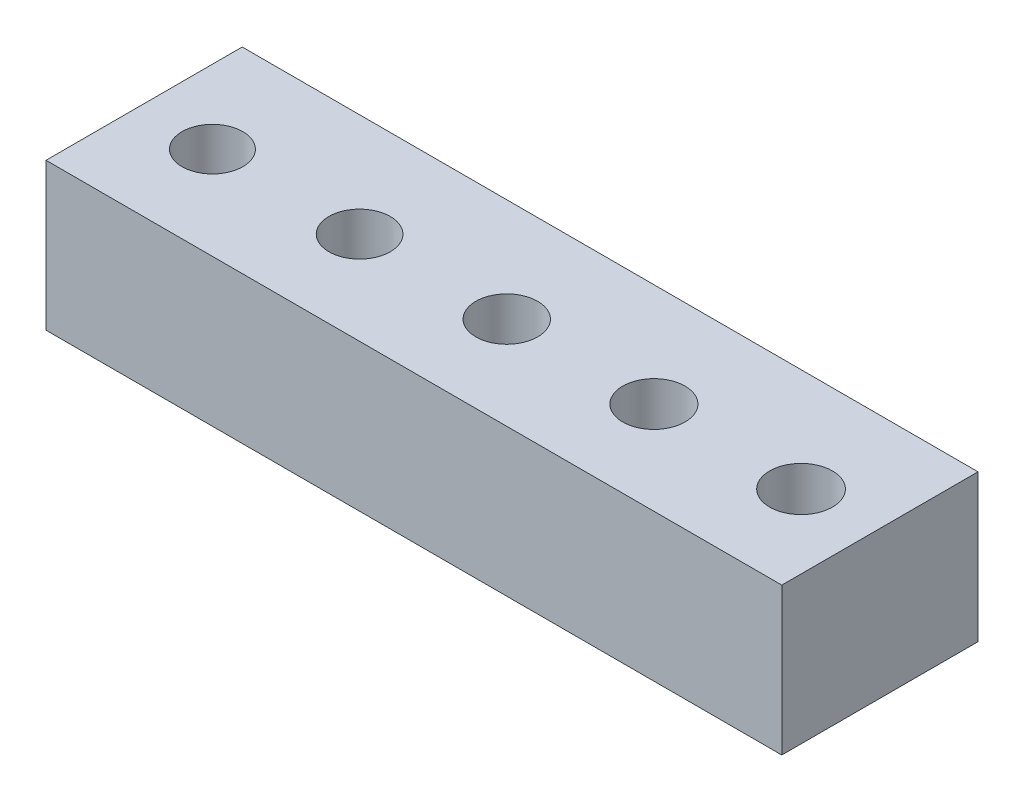
ISO-10303-21;
HEADER;
FILE_DESCRIPTION(('STEP AP214'),'2;1');
FILE_NAME('part.step','',(''),(''),'','','');
FILE_SCHEMA(('AUTOMOTIVE_DESIGN { 1 0 10303 214 1 1 1 1 }'));
ENDSEC;
DATA;
#1=APPLICATION_CONTEXT('core data for automotive mechanical design processes');
#2=APPLICATION_PROTOCOL_DEFINITION('international standard','automotive_design',2000,#1);
#3=PRODUCT_CONTEXT('',#1,'mechanical');
#4=PRODUCT('Part','Part','',(#3));
#5=PRODUCT_RELATED_PRODUCT_CATEGORY('part','',(#4));
#6=PRODUCT_DEFINITION_FORMATION('','',#4);
#7=PRODUCT_DEFINITION_CONTEXT('part definition',#1,'design');
#8=PRODUCT_DEFINITION('design','',#6,#7);
#9=PRODUCT_DEFINITION_SHAPE('','',#8);
#10=(LENGTH_UNIT() NAMED_UNIT(*) SI_UNIT(.MILLI.,.METRE.));
#11=(NAMED_UNIT(*) PLANE_ANGLE_UNIT() SI_UNIT($,.RADIAN.));
#12=(NAMED_UNIT(*) SI_UNIT($,.STERADIAN.) SOLID_ANGLE_UNIT());
#13=UNCERTAINTY_MEASURE_WITH_UNIT(LENGTH_MEASURE(1.E-05),#10,'distance_accuracy_value','');
#14=(GEOMETRIC_REPRESENTATION_CONTEXT(3) GLOBAL_UNCERTAINTY_ASSIGNED_CONTEXT((#13)) GLOBAL_UNIT_ASSIGNED_CONTEXT((#10,
#11,#12)) REPRESENTATION_CONTEXT('',''));
#15=CARTESIAN_POINT('',(0.,0.,0.));
#16=DIRECTION('',(0.,0.,1.));
#17=DIRECTION('',(1.,0.,0.));
#18=AXIS2_PLACEMENT_3D('',#15,#16,#17);
#19=CARTESIAN_POINT('',(0.,7.62,0.));
#20=DIRECTION('',(1.,0.,0.));
#21=DIRECTION('',(0.,0.,-1.));
#22=AXIS2_PLACEMENT_3D('',#19,#20,#21);
#23=PLANE('',#22);
#24=DIRECTION('',(0.,0.,1.));
#25=VECTOR('',#24,1.);
#26=CARTESIAN_POINT('',(0.,0.,0.));
#27=LINE('',#26,#25);
#28=CARTESIAN_POINT('',(0.,0.,-10.16));
#29=VERTEX_POINT('',#28);
#30=CARTESIAN_POINT('',(0.,0.,0.));
#31=VERTEX_POINT('',#30);
#32=EDGE_CURVE('E111',#29,#31,#27,.T.);
#33=ORIENTED_EDGE('',*,*,#32,.T.);
#34=DIRECTION('',(0.,-1.,0.));
#35=VECTOR('',#34,1.);
#36=CARTESIAN_POINT('',(0.,7.62,0.));
#37=LINE('',#36,#35);
#38=CARTESIAN_POINT('',(0.,7.62,0.));
#39=VERTEX_POINT('',#38);
#40=EDGE_CURVE('E11',#39,#31,#37,.T.);
#41=ORIENTED_EDGE('',*,*,#40,.F.);
#42=DIRECTION('',(0.,0.,1.));
#43=VECTOR('',#42,1.);
#44=CARTESIAN_POINT('',(0.,7.62,0.));
#45=LINE('',#44,#43);
#46=CARTESIAN_POINT('',(0.,7.62,-10.16));
#47=VERTEX_POINT('',#46);
#48=EDGE_CURVE('E95',#47,#39,#45,.T.);
#49=ORIENTED_EDGE('',*,*,#48,.F.);
#50=DIRECTION('',(0.,-1.,0.));
#51=VECTOR('',#50,1.);
#52=CARTESIAN_POINT('',(0.,7.62,-10.16));
#53=LINE('',#52,#51);
#54=EDGE_CURVE('E107',#47,#29,#53,.T.);
#55=ORIENTED_EDGE('',*,*,#54,.T.);
#56=EDGE_LOOP('',(#33,#41,#49,#55));
#57=FACE_BOUND('',#56,.T.);
#58=ADVANCED_FACE('F43',(#57),#23,.F.);
#59=CARTESIAN_POINT('',(0.,7.62,0.));
#60=DIRECTION('',(0.,0.,-1.));
#61=DIRECTION('',(-1.,0.,0.));
#62=AXIS2_PLACEMENT_3D('',#59,#60,#61);
#63=PLANE('',#62);
#64=DIRECTION('',(1.,0.,0.));
#65=VECTOR('',#64,1.);
#66=CARTESIAN_POINT('',(0.,0.,0.));
#67=LINE('',#66,#65);
#68=CARTESIAN_POINT('',(38.1,0.,0.));
#69=VERTEX_POINT('',#68);
#70=EDGE_CURVE('E100',#31,#69,#67,.T.);
#71=ORIENTED_EDGE('',*,*,#70,.T.);
#72=DIRECTION('',(0.,-1.,0.));
#73=VECTOR('',#72,1.);
#74=CARTESIAN_POINT('',(38.1,7.62,0.));
#75=LINE('',#74,#73);
#76=CARTESIAN_POINT('',(38.1,7.62,0.));
#77=VERTEX_POINT('',#76);
#78=EDGE_CURVE('E52',#77,#69,#75,.T.);
#79=ORIENTED_EDGE('',*,*,#78,.F.);
#80=DIRECTION('',(1.,0.,0.));
#81=VECTOR('',#80,1.);
#82=CARTESIAN_POINT('',(0.,7.62,0.));
#83=LINE('',#82,#81);
#84=EDGE_CURVE('E90',#39,#77,#83,.T.);
#85=ORIENTED_EDGE('',*,*,#84,.F.);
#86=ORIENTED_EDGE('',*,*,#40,.T.);
#87=EDGE_LOOP('',(#71,#79,#85,#86));
#88=FACE_BOUND('',#87,.T.);
#89=ADVANCED_FACE('F99',(#88),#63,.F.);
#90=CARTESIAN_POINT('',(38.1,7.62,0.));
#91=DIRECTION('',(-1.,0.,0.));
#92=DIRECTION('',(0.,0.,1.));
#93=AXIS2_PLACEMENT_3D('',#90,#91,#92);
#94=PLANE('',#93);
#95=DIRECTION('',(0.,0.,-1.));
#96=VECTOR('',#95,1.);
#97=CARTESIAN_POINT('',(38.1,0.,0.));
#98=LINE('',#97,#96);
#99=CARTESIAN_POINT('',(38.1,0.,-10.16));
#100=VERTEX_POINT('',#99);
#101=EDGE_CURVE('E77',#69,#100,#98,.T.);
#102=ORIENTED_EDGE('',*,*,#101,.T.);
#103=DIRECTION('',(0.,-1.,0.));
#104=VECTOR('',#103,1.);
#105=CARTESIAN_POINT('',(38.1,7.62,-10.16));
#106=LINE('',#105,#104);
#107=CARTESIAN_POINT('',(38.1,7.62,-10.16));
#108=VERTEX_POINT('',#107);
#109=EDGE_CURVE('E102',#108,#100,#106,.T.);
#110=ORIENTED_EDGE('',*,*,#109,.F.);
#111=DIRECTION('',(0.,0.,-1.));
#112=VECTOR('',#111,1.);
#113=CARTESIAN_POINT('',(38.1,7.62,0.));
#114=LINE('',#113,#112);
#115=EDGE_CURVE('E93',#77,#108,#114,.T.);
#116=ORIENTED_EDGE('',*,*,#115,.F.);
#117=ORIENTED_EDGE('',*,*,#78,.T.);
#118=EDGE_LOOP('',(#102,#110,#116,#117));
#119=FACE_BOUND('',#118,.T.);
#120=ADVANCED_FACE('F103',(#119),#94,.F.);
#121=CARTESIAN_POINT('',(0.,7.62,-10.16));
#122=DIRECTION('',(0.,0.,1.));
#123=DIRECTION('',(1.,0.,0.));
#124=AXIS2_PLACEMENT_3D('',#121,#122,#123);
#125=PLANE('',#124);
#126=DIRECTION('',(-1.,0.,0.));
#127=VECTOR('',#126,1.);
#128=CARTESIAN_POINT('',(0.,0.,-10.16));
#129=LINE('',#128,#127);
#130=EDGE_CURVE('E83',#100,#29,#129,.T.);
#131=ORIENTED_EDGE('',*,*,#130,.T.);
#132=ORIENTED_EDGE('',*,*,#54,.F.);
#133=DIRECTION('',(-1.,0.,0.));
#134=VECTOR('',#133,1.);
#135=CARTESIAN_POINT('',(0.,7.62,-10.16));
#136=LINE('',#135,#134);
#137=EDGE_CURVE('E60',#108,#47,#136,.T.);
#138=ORIENTED_EDGE('',*,*,#137,.F.);
#139=ORIENTED_EDGE('',*,*,#109,.T.);
#140=EDGE_LOOP('',(#131,#132,#138,#139));
#141=FACE_BOUND('',#140,.T.);
#142=ADVANCED_FACE('F125',(#141),#125,.F.);
#143=CARTESIAN_POINT('',(0.,7.62,0.));
#144=DIRECTION('',(0.,-1.,0.));
#145=DIRECTION('',(0.,0.,-1.));
#146=AXIS2_PLACEMENT_3D('',#143,#144,#145);
#147=PLANE('',#146);
#148=CARTESIAN_POINT('',(3.81,7.62,-4.80734647120761));
#149=DIRECTION('',(0.,-1.,0.));
#150=DIRECTION('',(0.,0.,-1.));
#151=AXIS2_PLACEMENT_3D('',#148,#149,#150);
#152=CIRCLE('',#151,1.5748);
#153=CARTESIAN_POINT('',(3.81,7.62,-6.38214647120761));
#154=VERTEX_POINT('',#153);
#155=EDGE_CURVE('E149',#154,#154,#152,.T.);
#156=ORIENTED_EDGE('',*,*,#155,.T.);
#157=EDGE_LOOP('',(#156));
#158=FACE_BOUND('',#157,.T.);
#159=CARTESIAN_POINT('',(19.05,7.62,-4.80734647120761));
#160=DIRECTION('',(0.,-1.,0.));
#161=DIRECTION('',(0.,0.,-1.));
#162=AXIS2_PLACEMENT_3D('',#159,#160,#161);
#163=CIRCLE('',#162,1.6002);
#164=CARTESIAN_POINT('',(19.05,7.62,-6.40754647120761));
#165=VERTEX_POINT('',#164);
#166=EDGE_CURVE('E154',#165,#165,#163,.T.);
#167=ORIENTED_EDGE('',*,*,#166,.T.);
#168=EDGE_LOOP('',(#167));
#169=FACE_BOUND('',#168,.T.);
#170=CARTESIAN_POINT('',(26.67,7.62,-4.80734647120761));
#171=DIRECTION('',(0.,-1.,0.));
#172=DIRECTION('',(0.,0.,-1.));
#173=AXIS2_PLACEMENT_3D('',#170,#171,#172);
#174=CIRCLE('',#173,1.6129);
#175=CARTESIAN_POINT('',(26.67,7.62,-6.42024647120761));
#176=VERTEX_POINT('',#175);
#177=EDGE_CURVE('E137',#176,#176,#174,.T.);
#178=ORIENTED_EDGE('',*,*,#177,.T.);
#179=EDGE_LOOP('',(#178));
#180=FACE_BOUND('',#179,.T.);
#181=CARTESIAN_POINT('',(34.29,7.62,-4.80734647120761));
#182=DIRECTION('',(0.,-1.,0.));
#183=DIRECTION('',(0.,0.,-1.));
#184=AXIS2_PLACEMENT_3D('',#181,#182,#183);
#185=CIRCLE('',#184,1.6256);
#186=CARTESIAN_POINT('',(34.29,7.62,-6.43294647120761));
#187=VERTEX_POINT('',#186);
#188=EDGE_CURVE('E136',#187,#187,#185,.T.);
#189=ORIENTED_EDGE('',*,*,#188,.T.);
#190=EDGE_LOOP('',(#189));
#191=FACE_BOUND('',#190,.T.);
#192=CARTESIAN_POINT('',(11.43,7.62,-4.80734647120761));
#193=DIRECTION('',(0.,-1.,0.));
#194=DIRECTION('',(0.,0.,-1.));
#195=AXIS2_PLACEMENT_3D('',#192,#193,#194);
#196=CIRCLE('',#195,1.5875);
#197=CARTESIAN_POINT('',(11.43,7.62,-6.39484647120761));
#198=VERTEX_POINT('',#197);
#199=EDGE_CURVE('E145',#198,#198,#196,.T.);
#200=ORIENTED_EDGE('',*,*,#199,.T.);
#201=EDGE_LOOP('',(#200));
#202=FACE_BOUND('',#201,.T.);
#203=ORIENTED_EDGE('',*,*,#48,.T.);
#204=ORIENTED_EDGE('',*,*,#84,.T.);
#205=ORIENTED_EDGE('',*,*,#115,.T.);
#206=ORIENTED_EDGE('',*,*,#137,.T.);
#207=EDGE_LOOP('',(#203,#204,#205,#206));
#208=FACE_BOUND('',#207,.T.);
#209=ADVANCED_FACE('F91',(#158,#169,#180,#191,#202,#208),#147,.F.);
#210=CARTESIAN_POINT('',(0.,0.,0.));
#211=DIRECTION('',(0.,-1.,0.));
#212=DIRECTION('',(0.,0.,-1.));
#213=AXIS2_PLACEMENT_3D('',#210,#211,#212);
#214=PLANE('',#213);
#215=ORIENTED_EDGE('',*,*,#32,.F.);
#216=ORIENTED_EDGE('',*,*,#130,.F.);
#217=ORIENTED_EDGE('',*,*,#101,.F.);
#218=ORIENTED_EDGE('',*,*,#70,.F.);
#219=EDGE_LOOP('',(#215,#216,#217,#218));
#220=FACE_BOUND('',#219,.T.);
#221=ADVANCED_FACE('F128',(#220),#214,.T.);
#222=CARTESIAN_POINT('',(11.43,2.8702,-4.80734647120761));
#223=DIRECTION('',(0.,1.,0.));
#224=DIRECTION('',(0.,0.,1.));
#225=AXIS2_PLACEMENT_3D('',#222,#223,#224);
#226=CYLINDRICAL_SURFACE('',#225,1.5875);
#227=CARTESIAN_POINT('',(11.43,2.8702,-4.80734647120761));
#228=DIRECTION('',(0.,-1.,0.));
#229=DIRECTION('',(0.,0.,-1.));
#230=AXIS2_PLACEMENT_3D('',#227,#228,#229);
#231=CIRCLE('',#230,1.5875);
#232=CARTESIAN_POINT('',(11.43,2.8702,-6.39484647120761));
#233=VERTEX_POINT('',#232);
#234=EDGE_CURVE('E141',#233,#233,#231,.T.);
#235=ORIENTED_EDGE('',*,*,#234,.T.);
#236=EDGE_LOOP('',(#235));
#237=FACE_BOUND('',#236,.T.);
#238=ORIENTED_EDGE('',*,*,#199,.F.);
#239=EDGE_LOOP('',(#238));
#240=FACE_BOUND('',#239,.T.);
#241=ADVANCED_FACE('F196',(#237,#240),#226,.F.);
#242=CARTESIAN_POINT('',(11.43,2.8702,-4.80734647120761));
#243=DIRECTION('',(0.,-1.,0.));
#244=DIRECTION('',(0.,0.,-1.));
#245=AXIS2_PLACEMENT_3D('',#242,#243,#244);
#246=PLANE('',#245);
#247=ORIENTED_EDGE('',*,*,#234,.F.);
#248=EDGE_LOOP('',(#247));
#249=FACE_BOUND('',#248,.T.);
#250=ADVANCED_FACE('F208',(#249),#246,.F.);
#251=CARTESIAN_POINT('',(34.29,2.8702,-4.80734647120761));
#252=DIRECTION('',(0.,1.,0.));
#253=DIRECTION('',(0.,0.,1.));
#254=AXIS2_PLACEMENT_3D('',#251,#252,#253);
#255=CYLINDRICAL_SURFACE('',#254,1.6256);
#256=CARTESIAN_POINT('',(34.29,2.8702,-4.80734647120761));
#257=DIRECTION('',(0.,-1.,0.));
#258=DIRECTION('',(0.,0.,-1.));
#259=AXIS2_PLACEMENT_3D('',#256,#257,#258);
#260=CIRCLE('',#259,1.6256);
#261=CARTESIAN_POINT('',(34.29,2.8702,-6.43294647120761));
#262=VERTEX_POINT('',#261);
#263=EDGE_CURVE('E132',#262,#262,#260,.T.);
#264=ORIENTED_EDGE('',*,*,#263,.T.);
#265=EDGE_LOOP('',(#264));
#266=FACE_BOUND('',#265,.T.);
#267=ORIENTED_EDGE('',*,*,#188,.F.);
#268=EDGE_LOOP('',(#267));
#269=FACE_BOUND('',#268,.T.);
#270=ADVANCED_FACE('F204',(#266,#269),#255,.F.);
#271=CARTESIAN_POINT('',(34.29,2.8702,-4.80734647120761));
#272=DIRECTION('',(0.,-1.,0.));
#273=DIRECTION('',(0.,0.,-1.));
#274=AXIS2_PLACEMENT_3D('',#271,#272,#273);
#275=PLANE('',#274);
#276=ORIENTED_EDGE('',*,*,#263,.F.);
#277=EDGE_LOOP('',(#276));
#278=FACE_BOUND('',#277,.T.);
#279=ADVANCED_FACE('F200',(#278),#275,.F.);
#280=CARTESIAN_POINT('',(26.67,2.8702,-4.80734647120761));
#281=DIRECTION('',(0.,1.,0.));
#282=DIRECTION('',(0.,0.,1.));
#283=AXIS2_PLACEMENT_3D('',#280,#281,#282);
#284=CYLINDRICAL_SURFACE('',#283,1.6129);
#285=CARTESIAN_POINT('',(26.67,2.8702,-4.80734647120761));
#286=DIRECTION('',(0.,-1.,0.));
#287=DIRECTION('',(0.,0.,-1.));
#288=AXIS2_PLACEMENT_3D('',#285,#286,#287);
#289=CIRCLE('',#288,1.6129);
#290=CARTESIAN_POINT('',(26.67,2.8702,-6.42024647120761));
#291=VERTEX_POINT('',#290);
#292=EDGE_CURVE('E158',#291,#291,#289,.T.);
#293=ORIENTED_EDGE('',*,*,#292,.T.);
#294=EDGE_LOOP('',(#293));
#295=FACE_BOUND('',#294,.T.);
#296=ORIENTED_EDGE('',*,*,#177,.F.);
#297=EDGE_LOOP('',(#296));
#298=FACE_BOUND('',#297,.T.);
#299=ADVANCED_FACE('F203',(#295,#298),#284,.F.);
#300=CARTESIAN_POINT('',(26.67,2.8702,-4.80734647120761));
#301=DIRECTION('',(0.,-1.,0.));
#302=DIRECTION('',(0.,0.,-1.));
#303=AXIS2_PLACEMENT_3D('',#300,#301,#302);
#304=PLANE('',#303);
#305=ORIENTED_EDGE('',*,*,#292,.F.);
#306=EDGE_LOOP('',(#305));
#307=FACE_BOUND('',#306,.T.);
#308=ADVANCED_FACE('F222',(#307),#304,.F.);
#309=CARTESIAN_POINT('',(19.05,2.8702,-4.80734647120761));
#310=DIRECTION('',(0.,1.,0.));
#311=DIRECTION('',(0.,0.,1.));
#312=AXIS2_PLACEMENT_3D('',#309,#310,#311);
#313=CYLINDRICAL_SURFACE('',#312,1.6002);
#314=CARTESIAN_POINT('',(19.05,2.8702,-4.80734647120761));
#315=DIRECTION('',(0.,-1.,0.));
#316=DIRECTION('',(0.,0.,-1.));
#317=AXIS2_PLACEMENT_3D('',#314,#315,#316);
#318=CIRCLE('',#317,1.6002);
#319=CARTESIAN_POINT('',(19.05,2.8702,-6.40754647120761));
#320=VERTEX_POINT('',#319);
#321=EDGE_CURVE('E150',#320,#320,#318,.T.);
#322=ORIENTED_EDGE('',*,*,#321,.T.);
#323=EDGE_LOOP('',(#322));
#324=FACE_BOUND('',#323,.T.);
#325=ORIENTED_EDGE('',*,*,#166,.F.);
#326=EDGE_LOOP('',(#325));
#327=FACE_BOUND('',#326,.T.);
#328=ADVANCED_FACE('F218',(#324,#327),#313,.F.);
#329=CARTESIAN_POINT('',(19.05,2.8702,-4.80734647120761));
#330=DIRECTION('',(0.,-1.,0.));
#331=DIRECTION('',(0.,0.,-1.));
#332=AXIS2_PLACEMENT_3D('',#329,#330,#331);
#333=PLANE('',#332);
#334=ORIENTED_EDGE('',*,*,#321,.F.);
#335=EDGE_LOOP('',(#334));
#336=FACE_BOUND('',#335,.T.);
#337=ADVANCED_FACE('F181',(#336),#333,.F.);
#338=CARTESIAN_POINT('',(3.81,2.8702,-4.80734647120761));
#339=DIRECTION('',(0.,1.,0.));
#340=DIRECTION('',(0.,0.,1.));
#341=AXIS2_PLACEMENT_3D('',#338,#339,#340);
#342=CYLINDRICAL_SURFACE('',#341,1.5748);
#343=CARTESIAN_POINT('',(3.81,2.8702,-4.80734647120761));
#344=DIRECTION('',(0.,-1.,0.));
#345=DIRECTION('',(0.,0.,-1.));
#346=AXIS2_PLACEMENT_3D('',#343,#344,#345);
#347=CIRCLE('',#346,1.5748);
#348=CARTESIAN_POINT('',(3.81,2.8702,-6.38214647120761));
#349=VERTEX_POINT('',#348);
#350=EDGE_CURVE('E115',#349,#349,#347,.T.);
#351=ORIENTED_EDGE('',*,*,#350,.T.);
#352=EDGE_LOOP('',(#351));
#353=FACE_BOUND('',#352,.T.);
#354=ORIENTED_EDGE('',*,*,#155,.F.);
#355=EDGE_LOOP('',(#354));
#356=FACE_BOUND('',#355,.T.);
#357=ADVANCED_FACE('F172',(#353,#356),#342,.F.);
#358=CARTESIAN_POINT('',(3.81,2.8702,-4.80734647120761));
#359=DIRECTION('',(0.,-1.,0.));
#360=DIRECTION('',(0.,0.,-1.));
#361=AXIS2_PLACEMENT_3D('',#358,#359,#360);
#362=PLANE('',#361);
#363=ORIENTED_EDGE('',*,*,#350,.F.);
#364=EDGE_LOOP('',(#363));
#365=FACE_BOUND('',#364,.T.);
#366=ADVANCED_FACE('F175',(#365),#362,.F.);
#367=CLOSED_SHELL('',(#58,#89,#120,#142,#209,#221,#241,#250,#270,#279,#299,#308,#328,#337,#357,#366));
#368=MANIFOLD_SOLID_BREP('B2',#367);
#369=ADVANCED_BREP_SHAPE_REPRESENTATION('',(#18,#368),#14);
#370=SHAPE_DEFINITION_REPRESENTATION(#9,#369);
ENDSEC;
END-ISO-10303-21;
